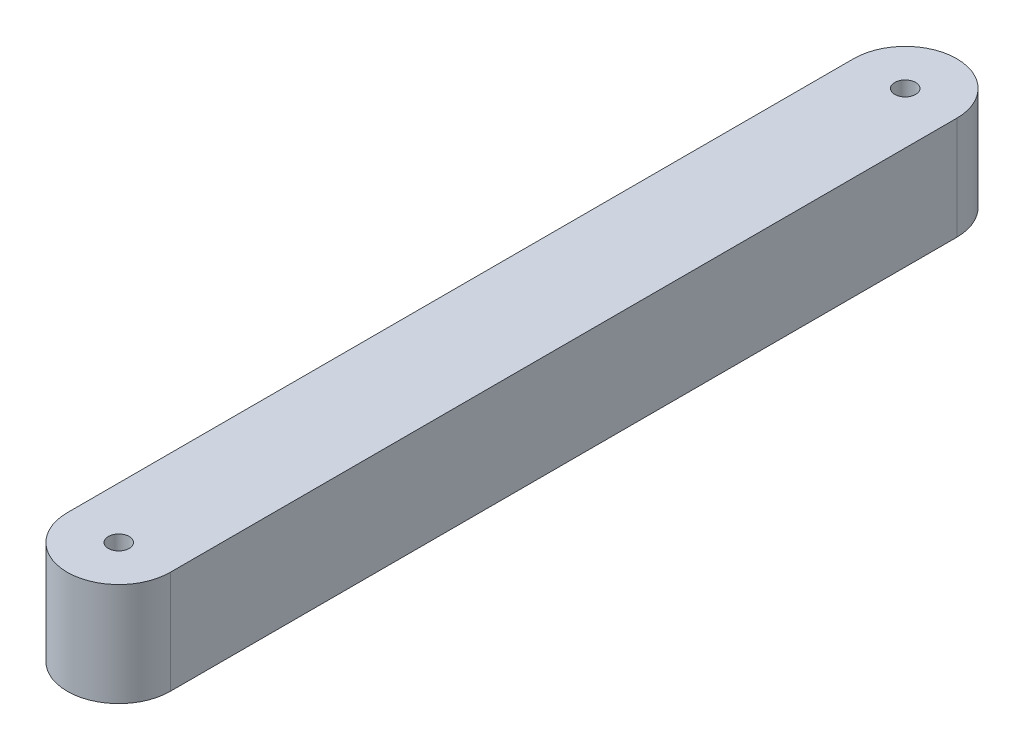
ISO-10303-21;
HEADER;
FILE_DESCRIPTION(('STEP AP214'),'2;1');
FILE_NAME('part.step','',(''),(''),'','','');
FILE_SCHEMA(('AUTOMOTIVE_DESIGN { 1 0 10303 214 1 1 1 1 }'));
ENDSEC;
DATA;
#1=APPLICATION_CONTEXT('core data for automotive mechanical design processes');
#2=APPLICATION_PROTOCOL_DEFINITION('international standard','automotive_design',2000,#1);
#3=PRODUCT_CONTEXT('',#1,'mechanical');
#4=PRODUCT('Part','Part','',(#3));
#5=PRODUCT_RELATED_PRODUCT_CATEGORY('part','',(#4));
#6=PRODUCT_DEFINITION_FORMATION('','',#4);
#7=PRODUCT_DEFINITION_CONTEXT('part definition',#1,'design');
#8=PRODUCT_DEFINITION('design','',#6,#7);
#9=PRODUCT_DEFINITION_SHAPE('','',#8);
#10=(LENGTH_UNIT() NAMED_UNIT(*) SI_UNIT(.MILLI.,.METRE.));
#11=(NAMED_UNIT(*) PLANE_ANGLE_UNIT() SI_UNIT($,.RADIAN.));
#12=(NAMED_UNIT(*) SI_UNIT($,.STERADIAN.) SOLID_ANGLE_UNIT());
#13=UNCERTAINTY_MEASURE_WITH_UNIT(LENGTH_MEASURE(1.E-05),#10,'distance_accuracy_value','');
#14=(GEOMETRIC_REPRESENTATION_CONTEXT(3) GLOBAL_UNCERTAINTY_ASSIGNED_CONTEXT((#13)) GLOBAL_UNIT_ASSIGNED_CONTEXT((#10,
#11,#12)) REPRESENTATION_CONTEXT('',''));
#15=CARTESIAN_POINT('',(0.,0.,0.));
#16=DIRECTION('',(0.,0.,1.));
#17=DIRECTION('',(1.,0.,0.));
#18=AXIS2_PLACEMENT_3D('',#15,#16,#17);
#19=CARTESIAN_POINT('',(0.,20.,0.));
#20=DIRECTION('',(0.,1.,0.));
#21=DIRECTION('',(0.,0.,1.));
#22=AXIS2_PLACEMENT_3D('',#19,#20,#21);
#23=PLANE('',#22);
#24=CARTESIAN_POINT('',(0.,20.,0.));
#25=DIRECTION('',(0.,1.,0.));
#26=DIRECTION('',(0.,0.,1.));
#27=AXIS2_PLACEMENT_3D('',#24,#25,#26);
#28=CIRCLE('',#27,2.02244834893166);
#29=CARTESIAN_POINT('',(0.,20.,2.02244834893166));
#30=VERTEX_POINT('',#29);
#31=EDGE_CURVE('E118',#30,#30,#28,.T.);
#32=ORIENTED_EDGE('',*,*,#31,.F.);
#33=EDGE_LOOP('',(#32));
#34=FACE_BOUND('',#33,.T.);
#35=CARTESIAN_POINT('',(0.,20.,0.));
#36=DIRECTION('',(0.,1.,0.));
#37=DIRECTION('',(0.,0.,1.));
#38=AXIS2_PLACEMENT_3D('',#35,#36,#37);
#39=CIRCLE('',#38,10.);
#40=CARTESIAN_POINT('',(-10.,20.,0.));
#41=VERTEX_POINT('',#40);
#42=CARTESIAN_POINT('',(10.,20.,0.));
#43=VERTEX_POINT('',#42);
#44=EDGE_CURVE('E98',#41,#43,#39,.T.);
#45=ORIENTED_EDGE('',*,*,#44,.T.);
#46=DIRECTION('',(0.,0.,-1.));
#47=VECTOR('',#46,1.);
#48=CARTESIAN_POINT('',(10.,20.,0.));
#49=LINE('',#48,#47);
#50=CARTESIAN_POINT('',(10.,20.,-152.5));
#51=VERTEX_POINT('',#50);
#52=EDGE_CURVE('E93',#43,#51,#49,.T.);
#53=ORIENTED_EDGE('',*,*,#52,.T.);
#54=CARTESIAN_POINT('',(0.,20.,-152.5));
#55=DIRECTION('',(0.,1.,0.));
#56=DIRECTION('',(0.,0.,1.));
#57=AXIS2_PLACEMENT_3D('',#54,#55,#56);
#58=CIRCLE('',#57,10.);
#59=CARTESIAN_POINT('',(-10.,20.,-152.5));
#60=VERTEX_POINT('',#59);
#61=EDGE_CURVE('E96',#51,#60,#58,.T.);
#62=ORIENTED_EDGE('',*,*,#61,.T.);
#63=DIRECTION('',(0.,0.,1.));
#64=VECTOR('',#63,1.);
#65=CARTESIAN_POINT('',(-10.,20.,0.));
#66=LINE('',#65,#64);
#67=EDGE_CURVE('E63',#60,#41,#66,.T.);
#68=ORIENTED_EDGE('',*,*,#67,.T.);
#69=EDGE_LOOP('',(#45,#53,#62,#68));
#70=FACE_BOUND('',#69,.T.);
#71=CARTESIAN_POINT('',(0.,20.,-152.5));
#72=DIRECTION('',(0.,1.,0.));
#73=DIRECTION('',(0.,0.,1.));
#74=AXIS2_PLACEMENT_3D('',#71,#72,#73);
#75=CIRCLE('',#74,2.02244834893166);
#76=CARTESIAN_POINT('',(0.,20.,-150.477551651068));
#77=VERTEX_POINT('',#76);
#78=EDGE_CURVE('E140',#77,#77,#75,.T.);
#79=ORIENTED_EDGE('',*,*,#78,.F.);
#80=EDGE_LOOP('',(#79));
#81=FACE_BOUND('',#80,.T.);
#82=ADVANCED_FACE('F45',(#34,#70,#81),#23,.T.);
#83=CARTESIAN_POINT('',(0.,0.,0.));
#84=DIRECTION('',(0.,1.,0.));
#85=DIRECTION('',(0.,0.,1.));
#86=AXIS2_PLACEMENT_3D('',#83,#84,#85);
#87=PLANE('',#86);
#88=CARTESIAN_POINT('',(0.,0.,0.));
#89=DIRECTION('',(0.,1.,0.));
#90=DIRECTION('',(0.,0.,1.));
#91=AXIS2_PLACEMENT_3D('',#88,#89,#90);
#92=CIRCLE('',#91,10.);
#93=CARTESIAN_POINT('',(-10.,0.,0.));
#94=VERTEX_POINT('',#93);
#95=CARTESIAN_POINT('',(10.,0.,0.));
#96=VERTEX_POINT('',#95);
#97=EDGE_CURVE('E114',#94,#96,#92,.T.);
#98=ORIENTED_EDGE('',*,*,#97,.F.);
#99=DIRECTION('',(0.,0.,1.));
#100=VECTOR('',#99,1.);
#101=CARTESIAN_POINT('',(-10.,0.,0.));
#102=LINE('',#101,#100);
#103=CARTESIAN_POINT('',(-10.,0.,-152.5));
#104=VERTEX_POINT('',#103);
#105=EDGE_CURVE('E86',#104,#94,#102,.T.);
#106=ORIENTED_EDGE('',*,*,#105,.F.);
#107=CARTESIAN_POINT('',(0.,0.,-152.5));
#108=DIRECTION('',(0.,1.,0.));
#109=DIRECTION('',(0.,0.,1.));
#110=AXIS2_PLACEMENT_3D('',#107,#108,#109);
#111=CIRCLE('',#110,10.);
#112=CARTESIAN_POINT('',(10.,0.,-152.5));
#113=VERTEX_POINT('',#112);
#114=EDGE_CURVE('E80',#113,#104,#111,.T.);
#115=ORIENTED_EDGE('',*,*,#114,.F.);
#116=DIRECTION('',(0.,0.,-1.));
#117=VECTOR('',#116,1.);
#118=CARTESIAN_POINT('',(10.,0.,0.));
#119=LINE('',#118,#117);
#120=EDGE_CURVE('E103',#96,#113,#119,.T.);
#121=ORIENTED_EDGE('',*,*,#120,.F.);
#122=EDGE_LOOP('',(#98,#106,#115,#121));
#123=FACE_BOUND('',#122,.T.);
#124=CARTESIAN_POINT('',(0.,0.,0.));
#125=DIRECTION('',(0.,1.,0.));
#126=DIRECTION('',(0.,0.,1.));
#127=AXIS2_PLACEMENT_3D('',#124,#125,#126);
#128=CIRCLE('',#127,2.02244834893166);
#129=CARTESIAN_POINT('',(0.,0.,2.02244834893166));
#130=VERTEX_POINT('',#129);
#131=EDGE_CURVE('E136',#130,#130,#128,.T.);
#132=ORIENTED_EDGE('',*,*,#131,.T.);
#133=EDGE_LOOP('',(#132));
#134=FACE_BOUND('',#133,.T.);
#135=CARTESIAN_POINT('',(0.,0.,-152.5));
#136=DIRECTION('',(0.,1.,0.));
#137=DIRECTION('',(0.,0.,1.));
#138=AXIS2_PLACEMENT_3D('',#135,#136,#137);
#139=CIRCLE('',#138,2.02244834893166);
#140=CARTESIAN_POINT('',(0.,0.,-150.477551651068));
#141=VERTEX_POINT('',#140);
#142=EDGE_CURVE('E144',#141,#141,#139,.T.);
#143=ORIENTED_EDGE('',*,*,#142,.T.);
#144=EDGE_LOOP('',(#143));
#145=FACE_BOUND('',#144,.T.);
#146=ADVANCED_FACE('F131',(#123,#134,#145),#87,.F.);
#147=CARTESIAN_POINT('',(0.,20.,0.));
#148=DIRECTION('',(0.,-1.,0.));
#149=DIRECTION('',(0.,0.,-1.));
#150=AXIS2_PLACEMENT_3D('',#147,#148,#149);
#151=CYLINDRICAL_SURFACE('',#150,10.);
#152=ORIENTED_EDGE('',*,*,#97,.T.);
#153=DIRECTION('',(0.,-1.,0.));
#154=VECTOR('',#153,1.);
#155=CARTESIAN_POINT('',(10.,20.,0.));
#156=LINE('',#155,#154);
#157=EDGE_CURVE('E11',#43,#96,#156,.T.);
#158=ORIENTED_EDGE('',*,*,#157,.F.);
#159=ORIENTED_EDGE('',*,*,#44,.F.);
#160=DIRECTION('',(0.,-1.,0.));
#161=VECTOR('',#160,1.);
#162=CARTESIAN_POINT('',(-10.,20.,0.));
#163=LINE('',#162,#161);
#164=EDGE_CURVE('E110',#41,#94,#163,.T.);
#165=ORIENTED_EDGE('',*,*,#164,.T.);
#166=EDGE_LOOP('',(#152,#158,#159,#165));
#167=FACE_BOUND('',#166,.T.);
#168=ADVANCED_FACE('F47',(#167),#151,.T.);
#169=CARTESIAN_POINT('',(10.,20.,0.));
#170=DIRECTION('',(-1.,0.,0.));
#171=DIRECTION('',(0.,0.,1.));
#172=AXIS2_PLACEMENT_3D('',#169,#170,#171);
#173=PLANE('',#172);
#174=ORIENTED_EDGE('',*,*,#120,.T.);
#175=DIRECTION('',(0.,-1.,0.));
#176=VECTOR('',#175,1.);
#177=CARTESIAN_POINT('',(10.,20.,-152.5));
#178=LINE('',#177,#176);
#179=EDGE_CURVE('E55',#51,#113,#178,.T.);
#180=ORIENTED_EDGE('',*,*,#179,.F.);
#181=ORIENTED_EDGE('',*,*,#52,.F.);
#182=ORIENTED_EDGE('',*,*,#157,.T.);
#183=EDGE_LOOP('',(#174,#180,#181,#182));
#184=FACE_BOUND('',#183,.T.);
#185=ADVANCED_FACE('F102',(#184),#173,.F.);
#186=CARTESIAN_POINT('',(0.,20.,-152.5));
#187=DIRECTION('',(0.,-1.,0.));
#188=DIRECTION('',(0.,0.,-1.));
#189=AXIS2_PLACEMENT_3D('',#186,#187,#188);
#190=CYLINDRICAL_SURFACE('',#189,10.);
#191=ORIENTED_EDGE('',*,*,#114,.T.);
#192=DIRECTION('',(0.,-1.,0.));
#193=VECTOR('',#192,1.);
#194=CARTESIAN_POINT('',(-10.,20.,-152.5));
#195=LINE('',#194,#193);
#196=EDGE_CURVE('E105',#60,#104,#195,.T.);
#197=ORIENTED_EDGE('',*,*,#196,.F.);
#198=ORIENTED_EDGE('',*,*,#61,.F.);
#199=ORIENTED_EDGE('',*,*,#179,.T.);
#200=EDGE_LOOP('',(#191,#197,#198,#199));
#201=FACE_BOUND('',#200,.T.);
#202=ADVANCED_FACE('F106',(#201),#190,.T.);
#203=CARTESIAN_POINT('',(-10.,20.,0.));
#204=DIRECTION('',(1.,0.,0.));
#205=DIRECTION('',(0.,0.,-1.));
#206=AXIS2_PLACEMENT_3D('',#203,#204,#205);
#207=PLANE('',#206);
#208=ORIENTED_EDGE('',*,*,#105,.T.);
#209=ORIENTED_EDGE('',*,*,#164,.F.);
#210=ORIENTED_EDGE('',*,*,#67,.F.);
#211=ORIENTED_EDGE('',*,*,#196,.T.);
#212=EDGE_LOOP('',(#208,#209,#210,#211));
#213=FACE_BOUND('',#212,.T.);
#214=ADVANCED_FACE('F128',(#213),#207,.F.);
#215=CARTESIAN_POINT('',(0.,20.,0.));
#216=DIRECTION('',(0.,-1.,0.));
#217=DIRECTION('',(0.,0.,-1.));
#218=AXIS2_PLACEMENT_3D('',#215,#216,#217);
#219=CYLINDRICAL_SURFACE('',#218,2.02244834893166);
#220=ORIENTED_EDGE('',*,*,#31,.T.);
#221=EDGE_LOOP('',(#220));
#222=FACE_BOUND('',#221,.T.);
#223=ORIENTED_EDGE('',*,*,#131,.F.);
#224=EDGE_LOOP('',(#223));
#225=FACE_BOUND('',#224,.T.);
#226=ADVANCED_FACE('F163',(#222,#225),#219,.F.);
#227=CARTESIAN_POINT('',(0.,20.,-152.5));
#228=DIRECTION('',(0.,-1.,0.));
#229=DIRECTION('',(0.,0.,-1.));
#230=AXIS2_PLACEMENT_3D('',#227,#228,#229);
#231=CYLINDRICAL_SURFACE('',#230,2.02244834893166);
#232=ORIENTED_EDGE('',*,*,#78,.T.);
#233=EDGE_LOOP('',(#232));
#234=FACE_BOUND('',#233,.T.);
#235=ORIENTED_EDGE('',*,*,#142,.F.);
#236=EDGE_LOOP('',(#235));
#237=FACE_BOUND('',#236,.T.);
#238=ADVANCED_FACE('F152',(#234,#237),#231,.F.);
#239=CLOSED_SHELL('',(#82,#146,#168,#185,#202,#214,#226,#238));
#240=MANIFOLD_SOLID_BREP('B2',#239);
#241=ADVANCED_BREP_SHAPE_REPRESENTATION('',(#18,#240),#14);
#242=SHAPE_DEFINITION_REPRESENTATION(#9,#241);
ENDSEC;
END-ISO-10303-21;
